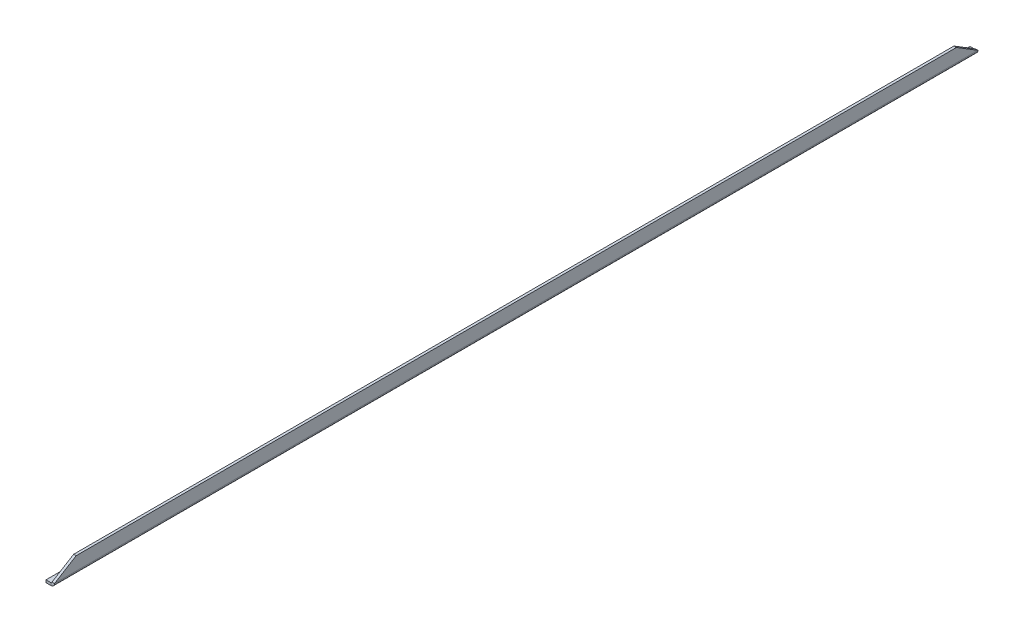
ISO-10303-21;
HEADER;
FILE_DESCRIPTION(('STEP AP214'),'2;1');
FILE_NAME('part.step','',(''),(''),'','','');
FILE_SCHEMA(('AUTOMOTIVE_DESIGN { 1 0 10303 214 1 1 1 1 }'));
ENDSEC;
DATA;
#1=APPLICATION_CONTEXT('core data for automotive mechanical design processes');
#2=APPLICATION_PROTOCOL_DEFINITION('international standard','automotive_design',2000,#1);
#3=PRODUCT_CONTEXT('',#1,'mechanical');
#4=PRODUCT('Part','Part','',(#3));
#5=PRODUCT_RELATED_PRODUCT_CATEGORY('part','',(#4));
#6=PRODUCT_DEFINITION_FORMATION('','',#4);
#7=PRODUCT_DEFINITION_CONTEXT('part definition',#1,'design');
#8=PRODUCT_DEFINITION('design','',#6,#7);
#9=PRODUCT_DEFINITION_SHAPE('','',#8);
#10=(LENGTH_UNIT() NAMED_UNIT(*) SI_UNIT(.MILLI.,.METRE.));
#11=(NAMED_UNIT(*) PLANE_ANGLE_UNIT() SI_UNIT($,.RADIAN.));
#12=(NAMED_UNIT(*) SI_UNIT($,.STERADIAN.) SOLID_ANGLE_UNIT());
#13=UNCERTAINTY_MEASURE_WITH_UNIT(LENGTH_MEASURE(1.E-05),#10,'distance_accuracy_value','');
#14=(GEOMETRIC_REPRESENTATION_CONTEXT(3) GLOBAL_UNCERTAINTY_ASSIGNED_CONTEXT((#13)) GLOBAL_UNIT_ASSIGNED_CONTEXT((#10,
#11,#12)) REPRESENTATION_CONTEXT('',''));
#15=CARTESIAN_POINT('',(0.,0.,0.));
#16=DIRECTION('',(0.,0.,1.));
#17=DIRECTION('',(1.,0.,0.));
#18=AXIS2_PLACEMENT_3D('',#15,#16,#17);
#19=CARTESIAN_POINT('',(1160.00000000001,1495.20392969546,260.));
#20=DIRECTION('',(-1.,0.,0.));
#21=DIRECTION('',(0.,-1.,0.));
#22=AXIS2_PLACEMENT_3D('',#19,#20,#21);
#23=PLANE('',#22);
#24=DIRECTION('',(0.,0.,1.));
#25=VECTOR('',#24,1.);
#26=CARTESIAN_POINT('',(1160.,-730.,-300.));
#27=LINE('',#26,#25);
#28=CARTESIAN_POINT('',(1160.,-730.,-856.292893218814));
#29=VERTEX_POINT('',#28);
#30=CARTESIAN_POINT('',(1160.,-730.,256.292893218813));
#31=VERTEX_POINT('',#30);
#32=EDGE_CURVE('E182',#29,#31,#27,.T.);
#33=ORIENTED_EDGE('',*,*,#32,.T.);
#34=DIRECTION('',(0.,-1.,0.));
#35=VECTOR('',#34,1.);
#36=CARTESIAN_POINT('',(1160.00000000001,1495.20392969546,256.292893218813));
#37=LINE('',#36,#35);
#38=CARTESIAN_POINT('',(1160.,-727.,256.292893218814));
#39=VERTEX_POINT('',#38);
#40=EDGE_CURVE('E425',#39,#31,#37,.T.);
#41=ORIENTED_EDGE('',*,*,#40,.F.);
#42=DIRECTION('',(0.,0.,1.));
#43=VECTOR('',#42,1.);
#44=CARTESIAN_POINT('',(1160.,-727.,260.));
#45=LINE('',#44,#43);
#46=CARTESIAN_POINT('',(1160.,-727.,-856.292893218813));
#47=VERTEX_POINT('',#46);
#48=EDGE_CURVE('E434',#39,#47,#45,.F.);
#49=ORIENTED_EDGE('',*,*,#48,.T.);
#50=DIRECTION('',(0.,-1.,0.));
#51=VECTOR('',#50,1.);
#52=CARTESIAN_POINT('',(1160.00000000001,1495.20392969546,-856.292893218814));
#53=LINE('',#52,#51);
#54=EDGE_CURVE('E174',#47,#29,#53,.T.);
#55=ORIENTED_EDGE('',*,*,#54,.T.);
#56=EDGE_LOOP('',(#33,#41,#49,#55));
#57=FACE_BOUND('',#56,.T.);
#58=ADVANCED_FACE('F59',(#57),#23,.T.);
#59=CARTESIAN_POINT('',(1167.00000000001,1495.20392969546,-856.292893218814));
#60=DIRECTION('',(0.,0.,1.));
#61=DIRECTION('',(-1.,0.,0.));
#62=AXIS2_PLACEMENT_3D('',#59,#60,#61);
#63=PLANE('',#62);
#64=CARTESIAN_POINT('',(1166.,-730.,-856.292893218814));
#65=CARTESIAN_POINT('',(1166.,-727.,-856.292893218814));
#66=B_SPLINE_CURVE_WITH_KNOTS('',1,(#64,#65),.UNSPECIFIED.,.F.,.F.,(2,2),(0.,1.),.UNSPECIFIED.);
#67=CARTESIAN_POINT('',(1166.,-727.,-856.292893218814));
#68=VERTEX_POINT('',#67);
#69=CARTESIAN_POINT('',(1166.,-730.,-856.292893218814));
#70=VERTEX_POINT('',#69);
#71=EDGE_CURVE('E163',#68,#70,#66,.F.);
#72=ORIENTED_EDGE('',*,*,#71,.T.);
#73=DIRECTION('',(-1.,0.,0.));
#74=VECTOR('',#73,1.);
#75=CARTESIAN_POINT('',(1167.,-730.,-856.292893218814));
#76=LINE('',#75,#74);
#77=EDGE_CURVE('E166',#70,#29,#76,.T.);
#78=ORIENTED_EDGE('',*,*,#77,.T.);
#79=ORIENTED_EDGE('',*,*,#54,.F.);
#80=DIRECTION('',(1.,0.,0.));
#81=VECTOR('',#80,1.);
#82=CARTESIAN_POINT('',(1167.,-727.,-856.292893218813));
#83=LINE('',#82,#81);
#84=EDGE_CURVE('E73',#68,#47,#83,.F.);
#85=ORIENTED_EDGE('',*,*,#84,.F.);
#86=EDGE_LOOP('',(#72,#78,#79,#85));
#87=FACE_BOUND('',#86,.T.);
#88=ADVANCED_FACE('F165',(#87),#63,.F.);
#89=CARTESIAN_POINT('',(1167.,-730.,-300.));
#90=DIRECTION('',(0.,1.,0.));
#91=DIRECTION('',(-1.,0.,0.));
#92=AXIS2_PLACEMENT_3D('',#89,#90,#91);
#93=PLANE('',#92);
#94=ORIENTED_EDGE('',*,*,#32,.F.);
#95=ORIENTED_EDGE('',*,*,#77,.F.);
#96=DIRECTION('',(0.,0.,-1.));
#97=VECTOR('',#96,1.);
#98=CARTESIAN_POINT('',(1166.,-730.,-856.292893218813));
#99=LINE('',#98,#97);
#100=CARTESIAN_POINT('',(1166.,-730.,256.292893218813));
#101=VERTEX_POINT('',#100);
#102=EDGE_CURVE('E180',#101,#70,#99,.T.);
#103=ORIENTED_EDGE('',*,*,#102,.F.);
#104=DIRECTION('',(-1.,0.,0.));
#105=VECTOR('',#104,1.);
#106=CARTESIAN_POINT('',(1167.,-730.,256.292893218813));
#107=LINE('',#106,#105);
#108=EDGE_CURVE('E184',#31,#101,#107,.F.);
#109=ORIENTED_EDGE('',*,*,#108,.F.);
#110=EDGE_LOOP('',(#94,#95,#103,#109));
#111=FACE_BOUND('',#110,.T.);
#112=ADVANCED_FACE('F179',(#111),#93,.F.);
#113=CARTESIAN_POINT('',(1167.00000000001,1495.20392969546,256.292893218813));
#114=DIRECTION('',(0.,0.,1.));
#115=DIRECTION('',(-1.,0.,0.));
#116=AXIS2_PLACEMENT_3D('',#113,#114,#115);
#117=PLANE('',#116);
#118=ORIENTED_EDGE('',*,*,#108,.T.);
#119=CARTESIAN_POINT('',(1166.,-727.,256.292893218813));
#120=CARTESIAN_POINT('',(1166.,-730.,256.292893218813));
#121=B_SPLINE_CURVE_WITH_KNOTS('',1,(#119,#120),.UNSPECIFIED.,.F.,.F.,(2,2),(0.,1.),.UNSPECIFIED.);
#122=CARTESIAN_POINT('',(1166.,-727.,256.292893218813));
#123=VERTEX_POINT('',#122);
#124=EDGE_CURVE('E109',#123,#101,#121,.T.);
#125=ORIENTED_EDGE('',*,*,#124,.F.);
#126=DIRECTION('',(1.,0.,0.));
#127=VECTOR('',#126,1.);
#128=CARTESIAN_POINT('',(1167.,-727.,256.292893218813));
#129=LINE('',#128,#127);
#130=EDGE_CURVE('E86',#123,#39,#129,.F.);
#131=ORIENTED_EDGE('',*,*,#130,.T.);
#132=ORIENTED_EDGE('',*,*,#40,.T.);
#133=EDGE_LOOP('',(#118,#125,#131,#132));
#134=FACE_BOUND('',#133,.T.);
#135=ADVANCED_FACE('F318',(#134),#117,.T.);
#136=CARTESIAN_POINT('',(1167.,-727.,-300.));
#137=DIRECTION('',(0.,1.,0.));
#138=DIRECTION('',(-1.,0.,0.));
#139=AXIS2_PLACEMENT_3D('',#136,#137,#138);
#140=PLANE('',#139);
#141=ORIENTED_EDGE('',*,*,#84,.T.);
#142=ORIENTED_EDGE('',*,*,#48,.F.);
#143=ORIENTED_EDGE('',*,*,#130,.F.);
#144=DIRECTION('',(0.,0.,-1.));
#145=VECTOR('',#144,1.);
#146=CARTESIAN_POINT('',(1166.,-727.,-856.292893218813));
#147=LINE('',#146,#145);
#148=EDGE_CURVE('E14',#123,#68,#147,.T.);
#149=ORIENTED_EDGE('',*,*,#148,.T.);
#150=EDGE_LOOP('',(#141,#142,#143,#149));
#151=FACE_BOUND('',#150,.T.);
#152=ADVANCED_FACE('F62',(#151),#140,.T.);
#153=CARTESIAN_POINT('',(1170.,80.,-300.));
#154=DIRECTION('',(1.,0.,0.));
#155=DIRECTION('',(0.,1.,0.));
#156=AXIS2_PLACEMENT_3D('',#153,#154,#155);
#157=PLANE('',#156);
#158=DIRECTION('',(0.,0.524097425664283,-0.851658316704576));
#159=VECTOR('',#158,1.);
#160=CARTESIAN_POINT('',(1170.,-256.437768240402,-507.03862660945));
#161=LINE('',#160,#159);
#162=CARTESIAN_POINT('',(1170.,-726.,256.000000000003));
#163=VERTEX_POINT('',#162);
#164=CARTESIAN_POINT('',(1170.,-710.000000000001,230.));
#165=VERTEX_POINT('',#164);
#166=EDGE_CURVE('E204',#163,#165,#161,.T.);
#167=ORIENTED_EDGE('',*,*,#166,.F.);
#168=DIRECTION('',(0.,0.,1.));
#169=VECTOR('',#168,1.);
#170=CARTESIAN_POINT('',(1170.,-726.,-300.));
#171=LINE('',#170,#169);
#172=CARTESIAN_POINT('',(1170.,-726.,-855.999999999991));
#173=VERTEX_POINT('',#172);
#174=EDGE_CURVE('E130',#163,#173,#171,.F.);
#175=ORIENTED_EDGE('',*,*,#174,.T.);
#176=DIRECTION('',(0.,0.524097425664272,0.851658316704582));
#177=VECTOR('',#176,1.);
#178=CARTESIAN_POINT('',(1170.,-256.437768240413,-92.9613733905489));
#179=LINE('',#178,#177);
#180=CARTESIAN_POINT('',(1170.,-710.000000000001,-830.));
#181=VERTEX_POINT('',#180);
#182=EDGE_CURVE('E271',#173,#181,#179,.T.);
#183=ORIENTED_EDGE('',*,*,#182,.T.);
#184=DIRECTION('',(0.,0.,1.));
#185=VECTOR('',#184,1.);
#186=CARTESIAN_POINT('',(1170.,-710.000000000001,-300.));
#187=LINE('',#186,#185);
#188=EDGE_CURVE('E261',#181,#165,#187,.T.);
#189=ORIENTED_EDGE('',*,*,#188,.T.);
#190=EDGE_LOOP('',(#167,#175,#183,#189));
#191=FACE_BOUND('',#190,.T.);
#192=ADVANCED_FACE('F235',(#191),#157,.T.);
#193=CARTESIAN_POINT('',(-1054.23020391323,-256.437768240394,-507.038626609449));
#194=DIRECTION('',(0.,-0.851658316704576,-0.524097425664283));
#195=DIRECTION('',(0.,0.524097425664283,-0.851658316704576));
#196=AXIS2_PLACEMENT_3D('',#193,#194,#195);
#197=PLANE('',#196);
#198=ORIENTED_EDGE('',*,*,#166,.T.);
#199=DIRECTION('',(1.,0.,0.));
#200=VECTOR('',#199,1.);
#201=CARTESIAN_POINT('',(-1054.23020391323,-709.999999999993,230.));
#202=LINE('',#201,#200);
#203=CARTESIAN_POINT('',(1167.,-710.000000000001,230.));
#204=VERTEX_POINT('',#203);
#205=EDGE_CURVE('E419',#204,#165,#202,.T.);
#206=ORIENTED_EDGE('',*,*,#205,.F.);
#207=DIRECTION('',(0.,0.524097425664283,-0.851658316704576));
#208=VECTOR('',#207,1.);
#209=CARTESIAN_POINT('',(1167.,-256.437768240402,-507.03862660945));
#210=LINE('',#209,#208);
#211=CARTESIAN_POINT('',(1167.,-726.,255.999999999997));
#212=VERTEX_POINT('',#211);
#213=EDGE_CURVE('E284',#212,#204,#210,.T.);
#214=ORIENTED_EDGE('',*,*,#213,.F.);
#215=CARTESIAN_POINT('',(1170.,-726.,256.000000000003));
#216=CARTESIAN_POINT('',(1167.,-726.,256.000000000003));
#217=B_SPLINE_CURVE_WITH_KNOTS('',1,(#215,#216),.UNSPECIFIED.,.F.,.F.,(2,2),(0.,1.),.UNSPECIFIED.);
#218=EDGE_CURVE('E292',#212,#163,#217,.F.);
#219=ORIENTED_EDGE('',*,*,#218,.T.);
#220=EDGE_LOOP('',(#198,#206,#214,#219));
#221=FACE_BOUND('',#220,.T.);
#222=ADVANCED_FACE('F298',(#221),#197,.F.);
#223=CARTESIAN_POINT('',(-1054.23020391323,-709.999999999993,-830.));
#224=DIRECTION('',(0.,-1.,0.));
#225=DIRECTION('',(1.,0.,0.));
#226=AXIS2_PLACEMENT_3D('',#223,#224,#225);
#227=PLANE('',#226);
#228=ORIENTED_EDGE('',*,*,#188,.F.);
#229=DIRECTION('',(1.,0.,0.));
#230=VECTOR('',#229,1.);
#231=CARTESIAN_POINT('',(-1054.23020391323,-709.999999999993,-830.));
#232=LINE('',#231,#230);
#233=CARTESIAN_POINT('',(1167.,-710.000000000001,-830.));
#234=VERTEX_POINT('',#233);
#235=EDGE_CURVE('E415',#234,#181,#232,.T.);
#236=ORIENTED_EDGE('',*,*,#235,.F.);
#237=DIRECTION('',(0.,0.,1.));
#238=VECTOR('',#237,1.);
#239=CARTESIAN_POINT('',(1167.,-710.000000000001,-830.));
#240=LINE('',#239,#238);
#241=EDGE_CURVE('E139',#204,#234,#240,.F.);
#242=ORIENTED_EDGE('',*,*,#241,.F.);
#243=ORIENTED_EDGE('',*,*,#205,.T.);
#244=EDGE_LOOP('',(#228,#236,#242,#243));
#245=FACE_BOUND('',#244,.T.);
#246=ADVANCED_FACE('F308',(#245),#227,.F.);
#247=CARTESIAN_POINT('',(-1054.23020391323,-256.437768240405,-92.9613733905487));
#248=DIRECTION('',(0.,0.851658316704583,-0.524097425664272));
#249=DIRECTION('',(0.,0.524097425664272,0.851658316704583));
#250=AXIS2_PLACEMENT_3D('',#247,#248,#249);
#251=PLANE('',#250);
#252=ORIENTED_EDGE('',*,*,#235,.T.);
#253=ORIENTED_EDGE('',*,*,#182,.F.);
#254=CARTESIAN_POINT('',(1167.,-726.,-856.000000000005));
#255=CARTESIAN_POINT('',(1170.,-726.,-856.000000000005));
#256=B_SPLINE_CURVE_WITH_KNOTS('',1,(#254,#255),.UNSPECIFIED.,.F.,.F.,(2,2),(0.,1.),.UNSPECIFIED.);
#257=CARTESIAN_POINT('',(1167.,-726.,-856.000000000005));
#258=VERTEX_POINT('',#257);
#259=EDGE_CURVE('E201',#258,#173,#256,.T.);
#260=ORIENTED_EDGE('',*,*,#259,.F.);
#261=DIRECTION('',(0.,0.524097425664272,0.851658316704582));
#262=VECTOR('',#261,1.);
#263=CARTESIAN_POINT('',(1167.,-256.437768240413,-92.9613733905489));
#264=LINE('',#263,#262);
#265=EDGE_CURVE('E409',#258,#234,#264,.T.);
#266=ORIENTED_EDGE('',*,*,#265,.T.);
#267=EDGE_LOOP('',(#252,#253,#260,#266));
#268=FACE_BOUND('',#267,.T.);
#269=ADVANCED_FACE('F467',(#268),#251,.T.);
#270=CARTESIAN_POINT('',(1167.,-726.,255.999999999997));
#271=DIRECTION('',(-1.,0.,0.));
#272=DIRECTION('',(0.,-1.,0.));
#273=AXIS2_PLACEMENT_3D('',#270,#271,#272);
#274=PLANE('',#273);
#275=DIRECTION('',(0.,0.,1.));
#276=VECTOR('',#275,1.);
#277=CARTESIAN_POINT('',(1167.,-726.,-300.));
#278=LINE('',#277,#276);
#279=EDGE_CURVE('E270',#212,#258,#278,.F.);
#280=ORIENTED_EDGE('',*,*,#279,.F.);
#281=ORIENTED_EDGE('',*,*,#213,.T.);
#282=ORIENTED_EDGE('',*,*,#241,.T.);
#283=ORIENTED_EDGE('',*,*,#265,.F.);
#284=EDGE_LOOP('',(#280,#281,#282,#283));
#285=FACE_BOUND('',#284,.T.);
#286=ADVANCED_FACE('F475',(#285),#274,.T.);
#287=CARTESIAN_POINT('',(1170.,-726.,256.000000000003));
#288=CARTESIAN_POINT('',(1170.,-726.523692974338,256.024412159349));
#289=CARTESIAN_POINT('',(1169.89589070667,-727.046991537437,256.048815536471));
#290=CARTESIAN_POINT('',(1169.49514555342,-728.014475921484,256.09763107294));
#291=CARTESIAN_POINT('',(1169.19866736959,-728.4581868799,256.122038841174));
#292=CARTESIAN_POINT('',(1168.4581868799,-729.198667369593,256.170854377642));
#293=CARTESIAN_POINT('',(1168.01447592148,-729.495145553417,256.195262145876));
#294=CARTESIAN_POINT('',(1167.04699153744,-729.895890706673,256.244077682345));
#295=CARTESIAN_POINT('',(1166.52369297434,-730.,256.268481059467));
#296=CARTESIAN_POINT('',(1166.,-730.,256.292893218813));
#297=CARTESIAN_POINT('',(1167.,-726.,256.000000000003));
#298=CARTESIAN_POINT('',(1167.,-726.130922501775,256.02441202103));
#299=CARTESIAN_POINT('',(1166.97397267667,-726.261747884359,256.048815536471));
#300=CARTESIAN_POINT('',(1166.87378638835,-726.503618980371,256.09763107294));
#301=CARTESIAN_POINT('',(1166.7996668424,-726.614546719975,256.122038841174));
#302=CARTESIAN_POINT('',(1166.61454671997,-726.799666842398,256.170854377642));
#303=CARTESIAN_POINT('',(1166.50361898037,-726.873786388354,256.195262145876));
#304=CARTESIAN_POINT('',(1166.26174788436,-726.973972676668,256.244077682345));
#305=CARTESIAN_POINT('',(1166.13092250177,-727.,256.268481197786));
#306=CARTESIAN_POINT('',(1166.,-727.,256.292893218813));
#307=B_SPLINE_SURFACE_WITH_KNOTS('',1,3,((#287,#288,#289,#290,#291,#292,#293,#294,#295,#296),
(#297,#298,#299,#300,#301,#302,#303,#304,#305,#306)),.UNSPECIFIED.,.F.,.F.,.F.,(2,2),(4,2,2,2,
4),(0.,1.),(0.,0.25,0.5,0.75,1.),.UNSPECIFIED.);
#308=CARTESIAN_POINT('',(1167.,-726.,256.000000000003));
#309=CARTESIAN_POINT('',(1167.,-726.130922501775,256.02441202103));
#310=CARTESIAN_POINT('',(1166.97397267667,-726.261747884359,256.048815536471));
#311=CARTESIAN_POINT('',(1166.87378638835,-726.503618980371,256.09763107294));
#312=CARTESIAN_POINT('',(1166.7996668424,-726.614546719975,256.122038841174));
#313=CARTESIAN_POINT('',(1166.61454671997,-726.799666842398,256.170854377642));
#314=CARTESIAN_POINT('',(1166.50361898037,-726.873786388354,256.195262145876));
#315=CARTESIAN_POINT('',(1166.26174788436,-726.973972676668,256.244077682345));
#316=CARTESIAN_POINT('',(1166.13092250177,-727.,256.268481197786));
#317=CARTESIAN_POINT('',(1166.,-727.,256.292893218813));
#318=B_SPLINE_CURVE_WITH_KNOTS('',3,(#308,#309,#310,#311,#312,#313,#314,#315,#316,#317),
.UNSPECIFIED.,.F.,.F.,(4,2,2,2,4),(0.,0.25,0.5,0.75,1.),.UNSPECIFIED.);
#319=EDGE_CURVE('E383',#212,#123,#318,.T.);
#320=CARTESIAN_POINT('',(1166.,-730.,256.292893218813));
#321=CARTESIAN_POINT('',(1166.52369297434,-730.,256.268481059467));
#322=CARTESIAN_POINT('',(1167.04699153744,-729.895890706673,256.244077682345));
#323=CARTESIAN_POINT('',(1168.01447592148,-729.495145553417,256.195262145876));
#324=CARTESIAN_POINT('',(1168.4581868799,-729.198667369593,256.170854377642));
#325=CARTESIAN_POINT('',(1169.19866736959,-728.4581868799,256.122038841174));
#326=CARTESIAN_POINT('',(1169.49514555342,-728.014475921484,256.09763107294));
#327=CARTESIAN_POINT('',(1169.89589070667,-727.046991537437,256.048815536471));
#328=CARTESIAN_POINT('',(1170.,-726.523692974338,256.024412159349));
#329=CARTESIAN_POINT('',(1170.,-726.,256.000000000003));
#330=B_SPLINE_CURVE_WITH_KNOTS('',3,(#320,#321,#322,#323,#324,#325,#326,#327,#328,#329),
.UNSPECIFIED.,.F.,.F.,(4,2,2,2,4),(0.,0.25,0.5,0.75,1.),.UNSPECIFIED.);
#331=EDGE_CURVE('E193',#163,#101,#330,.F.);
#332=ORIENTED_EDGE('',*,*,#218,.F.);
#333=ORIENTED_EDGE('',*,*,#319,.T.);
#334=ORIENTED_EDGE('',*,*,#124,.T.);
#335=ORIENTED_EDGE('',*,*,#331,.F.);
#336=EDGE_LOOP('',(#332,#333,#334,#335));
#337=FACE_BOUND('',#336,.T.);
#338=ADVANCED_FACE('F230',(#337),#307,.T.);
#339=CARTESIAN_POINT('',(1166.,-730.,-856.292893218814));
#340=CARTESIAN_POINT('',(1166.52369297434,-730.,-856.268481059467));
#341=CARTESIAN_POINT('',(1167.04699153744,-729.895890706674,-856.244077682346));
#342=CARTESIAN_POINT('',(1168.01447592148,-729.495145553417,-856.195262145877));
#343=CARTESIAN_POINT('',(1168.4581868799,-729.198667369593,-856.170854377644));
#344=CARTESIAN_POINT('',(1169.19866736959,-728.4581868799,-856.122038841175));
#345=CARTESIAN_POINT('',(1169.49514555342,-728.014475921484,-856.097631072942));
#346=CARTESIAN_POINT('',(1169.89589070667,-727.046991537437,-856.048815536473));
#347=CARTESIAN_POINT('',(1170.,-726.523692974338,-856.024412159352));
#348=CARTESIAN_POINT('',(1170.,-726.,-856.000000000005));
#349=CARTESIAN_POINT('',(1166.,-727.,-856.292893218814));
#350=CARTESIAN_POINT('',(1166.13092250177,-727.,-856.268481197787));
#351=CARTESIAN_POINT('',(1166.26174788436,-726.973972676668,-856.244077682346));
#352=CARTESIAN_POINT('',(1166.50361898037,-726.873786388354,-856.195262145877));
#353=CARTESIAN_POINT('',(1166.61454671997,-726.799666842398,-856.170854377644));
#354=CARTESIAN_POINT('',(1166.7996668424,-726.614546719975,-856.122038841175));
#355=CARTESIAN_POINT('',(1166.87378638835,-726.503618980371,-856.097631072942));
#356=CARTESIAN_POINT('',(1166.97397267667,-726.261747884359,-856.048815536473));
#357=CARTESIAN_POINT('',(1167.,-726.130922501775,-856.024412021033));
#358=CARTESIAN_POINT('',(1167.,-726.,-856.000000000005));
#359=B_SPLINE_SURFACE_WITH_KNOTS('',1,3,((#339,#340,#341,#342,#343,#344,#345,#346,#347,#348),
(#349,#350,#351,#352,#353,#354,#355,#356,#357,#358)),.UNSPECIFIED.,.F.,.F.,.F.,(2,2),(4,2,2,2,
4),(0.,1.),(0.,0.25,0.5,0.75,1.),.UNSPECIFIED.);
#360=CARTESIAN_POINT('',(1166.,-727.,-856.292893218814));
#361=CARTESIAN_POINT('',(1166.13092250177,-727.,-856.268481197787));
#362=CARTESIAN_POINT('',(1166.26174788436,-726.973972676668,-856.244077682346));
#363=CARTESIAN_POINT('',(1166.50361898037,-726.873786388354,-856.195262145877));
#364=CARTESIAN_POINT('',(1166.61454671997,-726.799666842398,-856.170854377644));
#365=CARTESIAN_POINT('',(1166.7996668424,-726.614546719975,-856.122038841175));
#366=CARTESIAN_POINT('',(1166.87378638835,-726.503618980371,-856.097631072942));
#367=CARTESIAN_POINT('',(1166.97397267667,-726.261747884359,-856.048815536473));
#368=CARTESIAN_POINT('',(1167.,-726.130922501775,-856.024412021033));
#369=CARTESIAN_POINT('',(1167.,-726.,-856.000000000005));
#370=B_SPLINE_CURVE_WITH_KNOTS('',3,(#360,#361,#362,#363,#364,#365,#366,#367,#368,#369),
.UNSPECIFIED.,.F.,.F.,(4,2,2,2,4),(0.,0.25,0.5,0.75,1.),.UNSPECIFIED.);
#371=EDGE_CURVE('E402',#68,#258,#370,.T.);
#372=CARTESIAN_POINT('',(1170.,-726.,-856.000000000005));
#373=CARTESIAN_POINT('',(1170.,-726.523692974338,-856.024412159352));
#374=CARTESIAN_POINT('',(1169.89589070667,-727.046991537437,-856.048815536473));
#375=CARTESIAN_POINT('',(1169.49514555342,-728.014475921484,-856.097631072942));
#376=CARTESIAN_POINT('',(1169.19866736959,-728.4581868799,-856.122038841175));
#377=CARTESIAN_POINT('',(1168.4581868799,-729.198667369593,-856.170854377644));
#378=CARTESIAN_POINT('',(1168.01447592148,-729.495145553417,-856.195262145877));
#379=CARTESIAN_POINT('',(1167.04699153744,-729.895890706674,-856.244077682346));
#380=CARTESIAN_POINT('',(1166.52369297434,-730.,-856.268481059467));
#381=CARTESIAN_POINT('',(1166.,-730.,-856.292893218814));
#382=B_SPLINE_CURVE_WITH_KNOTS('',3,(#372,#373,#374,#375,#376,#377,#378,#379,#380,#381),
.UNSPECIFIED.,.F.,.F.,(4,2,2,2,4),(0.,0.25,0.5,0.75,1.),.UNSPECIFIED.);
#383=EDGE_CURVE('E190',#70,#173,#382,.F.);
#384=ORIENTED_EDGE('',*,*,#371,.T.);
#385=ORIENTED_EDGE('',*,*,#259,.T.);
#386=ORIENTED_EDGE('',*,*,#383,.F.);
#387=ORIENTED_EDGE('',*,*,#71,.F.);
#388=EDGE_LOOP('',(#384,#385,#386,#387));
#389=FACE_BOUND('',#388,.T.);
#390=ADVANCED_FACE('F199',(#389),#359,.T.);
#391=CARTESIAN_POINT('',(1166.,-726.,-1969.01711842308));
#392=DIRECTION('',(0.,0.,1.));
#393=DIRECTION('',(0.,-1.,0.));
#394=AXIS2_PLACEMENT_3D('',#391,#392,#393);
#395=CYLINDRICAL_SURFACE('',#394,4.00000000000014);
#396=ORIENTED_EDGE('',*,*,#102,.T.);
#397=ORIENTED_EDGE('',*,*,#383,.T.);
#398=ORIENTED_EDGE('',*,*,#174,.F.);
#399=ORIENTED_EDGE('',*,*,#331,.T.);
#400=EDGE_LOOP('',(#396,#397,#398,#399));
#401=FACE_BOUND('',#400,.T.);
#402=ADVANCED_FACE('F189',(#401),#395,.T.);
#403=CARTESIAN_POINT('',(1166.,-726.,-1969.01711842308));
#404=DIRECTION('',(0.,0.,1.));
#405=DIRECTION('',(0.,-1.,0.));
#406=AXIS2_PLACEMENT_3D('',#403,#404,#405);
#407=CYLINDRICAL_SURFACE('',#406,1.0000000000001);
#408=ORIENTED_EDGE('',*,*,#148,.F.);
#409=ORIENTED_EDGE('',*,*,#319,.F.);
#410=ORIENTED_EDGE('',*,*,#279,.T.);
#411=ORIENTED_EDGE('',*,*,#371,.F.);
#412=EDGE_LOOP('',(#408,#409,#410,#411));
#413=FACE_BOUND('',#412,.T.);
#414=ADVANCED_FACE('F366',(#413),#407,.F.);
#415=CLOSED_SHELL('',(#58,#88,#112,#135,#152,#192,#222,#246,#269,#286,#338,#390,#402,#414));
#416=MANIFOLD_SOLID_BREP('B2',#415);
#417=ADVANCED_BREP_SHAPE_REPRESENTATION('',(#18,#416),#14);
#418=SHAPE_DEFINITION_REPRESENTATION(#9,#417);
ENDSEC;
END-ISO-10303-21;
